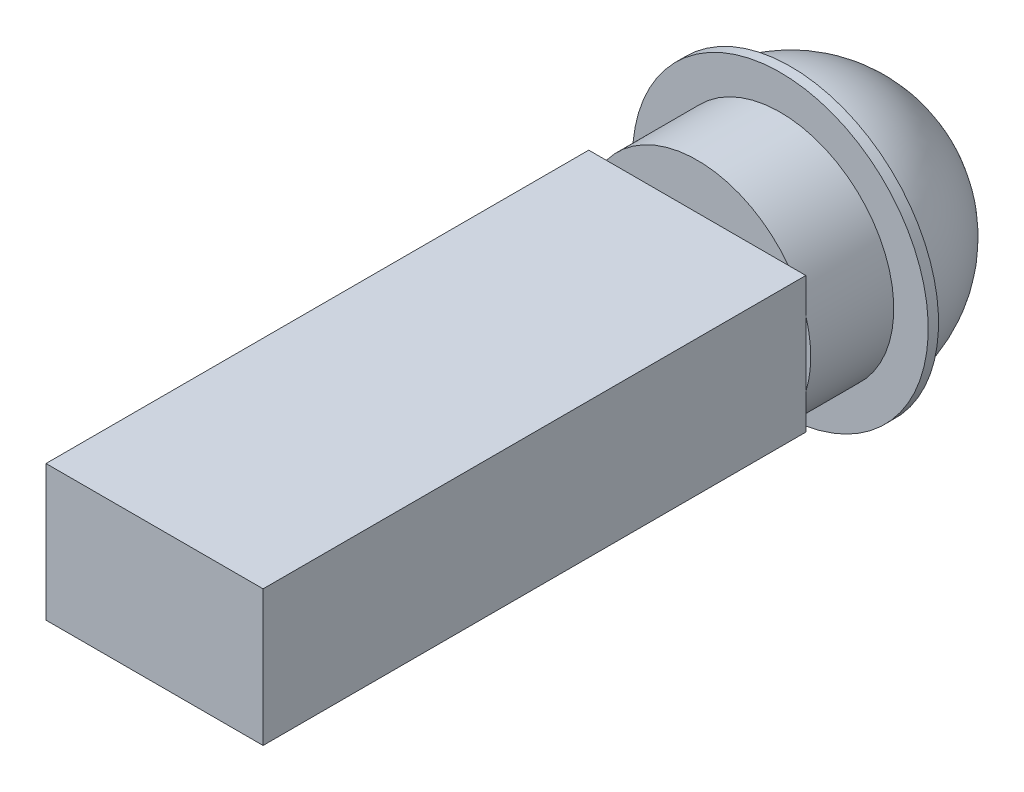
ISO-10303-21;
HEADER;
FILE_DESCRIPTION(('STEP AP214'),'2;1');
FILE_NAME('part.step','',(''),(''),'','','');
FILE_SCHEMA(('AUTOMOTIVE_DESIGN { 1 0 10303 214 1 1 1 1 }'));
ENDSEC;
DATA;
#1=APPLICATION_CONTEXT('core data for automotive mechanical design processes');
#2=APPLICATION_PROTOCOL_DEFINITION('international standard','automotive_design',2000,#1);
#3=PRODUCT_CONTEXT('',#1,'mechanical');
#4=PRODUCT('Part','Part','',(#3));
#5=PRODUCT_RELATED_PRODUCT_CATEGORY('part','',(#4));
#6=PRODUCT_DEFINITION_FORMATION('','',#4);
#7=PRODUCT_DEFINITION_CONTEXT('part definition',#1,'design');
#8=PRODUCT_DEFINITION('design','',#6,#7);
#9=PRODUCT_DEFINITION_SHAPE('','',#8);
#10=(LENGTH_UNIT() NAMED_UNIT(*) SI_UNIT(.MILLI.,.METRE.));
#11=(NAMED_UNIT(*) PLANE_ANGLE_UNIT() SI_UNIT($,.RADIAN.));
#12=(NAMED_UNIT(*) SI_UNIT($,.STERADIAN.) SOLID_ANGLE_UNIT());
#13=UNCERTAINTY_MEASURE_WITH_UNIT(LENGTH_MEASURE(1.E-05),#10,'distance_accuracy_value','');
#14=(GEOMETRIC_REPRESENTATION_CONTEXT(3) GLOBAL_UNCERTAINTY_ASSIGNED_CONTEXT((#13)) GLOBAL_UNIT_ASSIGNED_CONTEXT((#10,
#11,#12)) REPRESENTATION_CONTEXT('',''));
#15=CARTESIAN_POINT('',(0.,0.,0.));
#16=DIRECTION('',(0.,0.,1.));
#17=DIRECTION('',(1.,0.,0.));
#18=AXIS2_PLACEMENT_3D('',#15,#16,#17);
#19=CARTESIAN_POINT('',(0.,0.,4.3688));
#20=DIRECTION('',(0.,0.,1.));
#21=DIRECTION('',(1.,0.,0.));
#22=AXIS2_PLACEMENT_3D('',#19,#20,#21);
#23=PLANE('',#22);
#24=DIRECTION('',(0.,-1.,0.));
#25=VECTOR('',#24,1.);
#26=CARTESIAN_POINT('',(-5.08,3.175,4.3688));
#27=LINE('',#26,#25);
#28=CARTESIAN_POINT('',(-5.08,1.54104962931113,4.3688));
#29=VERTEX_POINT('',#28);
#30=CARTESIAN_POINT('',(-5.08,-1.54104962931113,4.3688));
#31=VERTEX_POINT('',#30);
#32=EDGE_CURVE('E11',#29,#31,#27,.T.);
#33=ORIENTED_EDGE('',*,*,#32,.F.);
#34=CARTESIAN_POINT('',(0.,0.,4.3688));
#35=DIRECTION('',(0.,0.,-1.));
#36=DIRECTION('',(-1.,0.,0.));
#37=AXIS2_PLACEMENT_3D('',#34,#35,#36);
#38=CIRCLE('',#37,5.3086);
#39=EDGE_CURVE('E51',#31,#29,#38,.T.);
#40=ORIENTED_EDGE('',*,*,#39,.F.);
#41=EDGE_LOOP('',(#33,#40));
#42=FACE_BOUND('',#41,.T.);
#43=ADVANCED_FACE('F33',(#42),#23,.T.);
#44=DIRECTION('',(-1.,0.,0.));
#45=VECTOR('',#44,1.);
#46=CARTESIAN_POINT('',(5.08,3.175,4.3688));
#47=LINE('',#46,#45);
#48=CARTESIAN_POINT('',(4.25448104473389,3.175,4.3688));
#49=VERTEX_POINT('',#48);
#50=CARTESIAN_POINT('',(-4.25448104473389,3.175,4.3688));
#51=VERTEX_POINT('',#50);
#52=EDGE_CURVE('E42',#49,#51,#47,.T.);
#53=ORIENTED_EDGE('',*,*,#52,.F.);
#54=EDGE_CURVE('E151',#51,#49,#38,.T.);
#55=ORIENTED_EDGE('',*,*,#54,.F.);
#56=EDGE_LOOP('',(#53,#55));
#57=FACE_BOUND('',#56,.T.);
#58=ADVANCED_FACE('F213',(#57),#23,.T.);
#59=DIRECTION('',(0.,1.,0.));
#60=VECTOR('',#59,1.);
#61=CARTESIAN_POINT('',(5.08,3.175,4.3688));
#62=LINE('',#61,#60);
#63=CARTESIAN_POINT('',(5.08,-1.54104962931114,4.3688));
#64=VERTEX_POINT('',#63);
#65=CARTESIAN_POINT('',(5.08,1.54104962931114,4.3688));
#66=VERTEX_POINT('',#65);
#67=EDGE_CURVE('E154',#64,#66,#62,.T.);
#68=ORIENTED_EDGE('',*,*,#67,.F.);
#69=EDGE_CURVE('E161',#66,#64,#38,.T.);
#70=ORIENTED_EDGE('',*,*,#69,.F.);
#71=EDGE_LOOP('',(#68,#70));
#72=FACE_BOUND('',#71,.T.);
#73=ADVANCED_FACE('F218',(#72),#23,.T.);
#74=CARTESIAN_POINT('',(0.,0.,0.));
#75=DIRECTION('',(0.,0.,-1.));
#76=DIRECTION('',(1.,0.,0.));
#77=AXIS2_PLACEMENT_3D('',#74,#75,#76);
#78=SPHERICAL_SURFACE('',#77,6.20395);
#79=CARTESIAN_POINT('',(0.,0.,0.));
#80=DIRECTION('',(0.,0.,-1.));
#81=DIRECTION('',(-1.,0.,0.));
#82=AXIS2_PLACEMENT_3D('',#79,#80,#81);
#83=CIRCLE('',#82,6.20395);
#84=CARTESIAN_POINT('',(-6.20395,0.,0.));
#85=VERTEX_POINT('',#84);
#86=EDGE_CURVE('E129',#85,#85,#83,.T.);
#87=ORIENTED_EDGE('',*,*,#86,.T.);
#88=EDGE_LOOP('',(#87));
#89=FACE_BOUND('',#88,.T.);
#90=ADVANCED_FACE('F35',(#89),#78,.T.);
#91=DIRECTION('',(1.,0.,0.));
#92=VECTOR('',#91,1.);
#93=CARTESIAN_POINT('',(5.08,-3.175,4.3688));
#94=LINE('',#93,#92);
#95=CARTESIAN_POINT('',(-4.25448104473389,-3.175,4.3688));
#96=VERTEX_POINT('',#95);
#97=CARTESIAN_POINT('',(4.25448104473389,-3.175,4.3688));
#98=VERTEX_POINT('',#97);
#99=EDGE_CURVE('E58',#96,#98,#94,.T.);
#100=ORIENTED_EDGE('',*,*,#99,.F.);
#101=EDGE_CURVE('E150',#98,#96,#38,.T.);
#102=ORIENTED_EDGE('',*,*,#101,.F.);
#103=EDGE_LOOP('',(#100,#102));
#104=FACE_BOUND('',#103,.T.);
#105=ADVANCED_FACE('F214',(#104),#23,.T.);
#106=CARTESIAN_POINT('',(0.,0.,-6.20395));
#107=DIRECTION('',(0.,0.,-1.));
#108=DIRECTION('',(-1.,0.,0.));
#109=AXIS2_PLACEMENT_3D('',#106,#107,#108);
#110=CYLINDRICAL_SURFACE('',#109,5.3086);
#111=EDGE_CURVE('E37',#29,#51,#38,.T.);
#112=ORIENTED_EDGE('',*,*,#111,.T.);
#113=ORIENTED_EDGE('',*,*,#54,.T.);
#114=EDGE_CURVE('E158',#49,#66,#38,.T.);
#115=ORIENTED_EDGE('',*,*,#114,.T.);
#116=ORIENTED_EDGE('',*,*,#69,.T.);
#117=EDGE_CURVE('E164',#64,#98,#38,.T.);
#118=ORIENTED_EDGE('',*,*,#117,.T.);
#119=ORIENTED_EDGE('',*,*,#101,.T.);
#120=EDGE_CURVE('E146',#96,#31,#38,.T.);
#121=ORIENTED_EDGE('',*,*,#120,.T.);
#122=ORIENTED_EDGE('',*,*,#39,.T.);
#123=EDGE_LOOP('',(#112,#113,#115,#116,#118,#119,#121,#122));
#124=FACE_BOUND('',#123,.T.);
#125=CARTESIAN_POINT('',(0.,0.,0.482599999999999));
#126=DIRECTION('',(0.,0.,-1.));
#127=DIRECTION('',(-1.,0.,0.));
#128=AXIS2_PLACEMENT_3D('',#125,#126,#127);
#129=CIRCLE('',#128,5.3086);
#130=CARTESIAN_POINT('',(-5.3086,0.,0.482599999999999));
#131=VERTEX_POINT('',#130);
#132=EDGE_CURVE('E142',#131,#131,#129,.T.);
#133=ORIENTED_EDGE('',*,*,#132,.F.);
#134=EDGE_LOOP('',(#133));
#135=FACE_BOUND('',#134,.T.);
#136=ADVANCED_FACE('F167',(#124,#135),#110,.T.);
#137=CARTESIAN_POINT('',(-5.3086,0.,0.4826));
#138=DIRECTION('',(0.,0.,1.));
#139=DIRECTION('',(1.,0.,0.));
#140=AXIS2_PLACEMENT_3D('',#137,#138,#139);
#141=PLANE('',#140);
#142=ORIENTED_EDGE('',*,*,#132,.T.);
#143=EDGE_LOOP('',(#142));
#144=FACE_BOUND('',#143,.T.);
#145=CARTESIAN_POINT('',(0.,0.,0.4826));
#146=DIRECTION('',(0.,0.,-1.));
#147=DIRECTION('',(-1.,0.,0.));
#148=AXIS2_PLACEMENT_3D('',#145,#146,#147);
#149=CIRCLE('',#148,6.9215);
#150=CARTESIAN_POINT('',(-6.9215,0.,0.4826));
#151=VERTEX_POINT('',#150);
#152=EDGE_CURVE('E140',#151,#151,#149,.T.);
#153=ORIENTED_EDGE('',*,*,#152,.F.);
#154=EDGE_LOOP('',(#153));
#155=FACE_BOUND('',#154,.T.);
#156=ADVANCED_FACE('F226',(#144,#155),#141,.T.);
#157=CARTESIAN_POINT('',(0.,0.,-6.20395));
#158=DIRECTION('',(0.,0.,-1.));
#159=DIRECTION('',(-1.,0.,0.));
#160=AXIS2_PLACEMENT_3D('',#157,#158,#159);
#161=CYLINDRICAL_SURFACE('',#160,6.9215);
#162=ORIENTED_EDGE('',*,*,#152,.T.);
#163=EDGE_LOOP('',(#162));
#164=FACE_BOUND('',#163,.T.);
#165=CARTESIAN_POINT('',(0.,0.,0.));
#166=DIRECTION('',(0.,0.,-1.));
#167=DIRECTION('',(-1.,0.,0.));
#168=AXIS2_PLACEMENT_3D('',#165,#166,#167);
#169=CIRCLE('',#168,6.9215);
#170=CARTESIAN_POINT('',(-6.9215,0.,0.));
#171=VERTEX_POINT('',#170);
#172=EDGE_CURVE('E132',#171,#171,#169,.T.);
#173=ORIENTED_EDGE('',*,*,#172,.F.);
#174=EDGE_LOOP('',(#173));
#175=FACE_BOUND('',#174,.T.);
#176=ADVANCED_FACE('F206',(#164,#175),#161,.T.);
#177=CARTESIAN_POINT('',(-6.9215,0.,0.));
#178=DIRECTION('',(0.,0.,-1.));
#179=DIRECTION('',(-1.,0.,0.));
#180=AXIS2_PLACEMENT_3D('',#177,#178,#179);
#181=PLANE('',#180);
#182=ORIENTED_EDGE('',*,*,#172,.T.);
#183=EDGE_LOOP('',(#182));
#184=FACE_BOUND('',#183,.T.);
#185=ORIENTED_EDGE('',*,*,#86,.F.);
#186=EDGE_LOOP('',(#185));
#187=FACE_BOUND('',#186,.T.);
#188=ADVANCED_FACE('F199',(#184,#187),#181,.T.);
#189=CARTESIAN_POINT('',(0.,0.,4.3688));
#190=DIRECTION('',(0.,0.,-1.));
#191=DIRECTION('',(-1.,0.,0.));
#192=AXIS2_PLACEMENT_3D('',#189,#190,#191);
#193=PLANE('',#192);
#194=ORIENTED_EDGE('',*,*,#111,.F.);
#195=CARTESIAN_POINT('',(-5.08,3.175,4.3688));
#196=VERTEX_POINT('',#195);
#197=EDGE_CURVE('E44',#196,#29,#27,.T.);
#198=ORIENTED_EDGE('',*,*,#197,.F.);
#199=EDGE_CURVE('E178',#51,#196,#47,.T.);
#200=ORIENTED_EDGE('',*,*,#199,.F.);
#201=EDGE_LOOP('',(#194,#198,#200));
#202=FACE_BOUND('',#201,.T.);
#203=ADVANCED_FACE('F197',(#202),#193,.T.);
#204=ORIENTED_EDGE('',*,*,#114,.F.);
#205=CARTESIAN_POINT('',(5.08,3.175,4.3688));
#206=VERTEX_POINT('',#205);
#207=EDGE_CURVE('E123',#206,#49,#47,.T.);
#208=ORIENTED_EDGE('',*,*,#207,.F.);
#209=EDGE_CURVE('E172',#66,#206,#62,.T.);
#210=ORIENTED_EDGE('',*,*,#209,.F.);
#211=EDGE_LOOP('',(#204,#208,#210));
#212=FACE_BOUND('',#211,.T.);
#213=ADVANCED_FACE('F190',(#212),#193,.T.);
#214=ORIENTED_EDGE('',*,*,#117,.F.);
#215=CARTESIAN_POINT('',(5.08,-3.175,4.3688));
#216=VERTEX_POINT('',#215);
#217=EDGE_CURVE('E173',#216,#64,#62,.T.);
#218=ORIENTED_EDGE('',*,*,#217,.F.);
#219=EDGE_CURVE('E157',#98,#216,#94,.T.);
#220=ORIENTED_EDGE('',*,*,#219,.F.);
#221=EDGE_LOOP('',(#214,#218,#220));
#222=FACE_BOUND('',#221,.T.);
#223=ADVANCED_FACE('F205',(#222),#193,.T.);
#224=ORIENTED_EDGE('',*,*,#120,.F.);
#225=CARTESIAN_POINT('',(-5.08,-3.175,4.3688));
#226=VERTEX_POINT('',#225);
#227=EDGE_CURVE('E156',#226,#96,#94,.T.);
#228=ORIENTED_EDGE('',*,*,#227,.F.);
#229=EDGE_CURVE('E45',#31,#226,#27,.T.);
#230=ORIENTED_EDGE('',*,*,#229,.F.);
#231=EDGE_LOOP('',(#224,#228,#230));
#232=FACE_BOUND('',#231,.T.);
#233=ADVANCED_FACE('F171',(#232),#193,.T.);
#234=CARTESIAN_POINT('',(-5.08,3.175,29.7688));
#235=DIRECTION('',(1.,0.,0.));
#236=DIRECTION('',(0.,1.,0.));
#237=AXIS2_PLACEMENT_3D('',#234,#235,#236);
#238=PLANE('',#237);
#239=ORIENTED_EDGE('',*,*,#197,.T.);
#240=ORIENTED_EDGE('',*,*,#32,.T.);
#241=ORIENTED_EDGE('',*,*,#229,.T.);
#242=DIRECTION('',(0.,0.,-1.));
#243=VECTOR('',#242,1.);
#244=CARTESIAN_POINT('',(-5.08,-3.175,29.7688));
#245=LINE('',#244,#243);
#246=CARTESIAN_POINT('',(-5.08,-3.175,29.7688));
#247=VERTEX_POINT('',#246);
#248=EDGE_CURVE('E108',#247,#226,#245,.T.);
#249=ORIENTED_EDGE('',*,*,#248,.F.);
#250=DIRECTION('',(0.,-1.,0.));
#251=VECTOR('',#250,1.);
#252=CARTESIAN_POINT('',(-5.08,3.175,29.7688));
#253=LINE('',#252,#251);
#254=CARTESIAN_POINT('',(-5.08,3.175,29.7688));
#255=VERTEX_POINT('',#254);
#256=EDGE_CURVE('E114',#255,#247,#253,.T.);
#257=ORIENTED_EDGE('',*,*,#256,.F.);
#258=DIRECTION('',(0.,0.,-1.));
#259=VECTOR('',#258,1.);
#260=CARTESIAN_POINT('',(-5.08,3.175,29.7688));
#261=LINE('',#260,#259);
#262=EDGE_CURVE('E181',#255,#196,#261,.T.);
#263=ORIENTED_EDGE('',*,*,#262,.T.);
#264=EDGE_LOOP('',(#239,#240,#241,#249,#257,#263));
#265=FACE_BOUND('',#264,.T.);
#266=ADVANCED_FACE('F126',(#265),#238,.F.);
#267=CARTESIAN_POINT('',(5.08,-3.175,29.7688));
#268=DIRECTION('',(0.,1.,0.));
#269=DIRECTION('',(-1.,0.,0.));
#270=AXIS2_PLACEMENT_3D('',#267,#268,#269);
#271=PLANE('',#270);
#272=ORIENTED_EDGE('',*,*,#227,.T.);
#273=ORIENTED_EDGE('',*,*,#99,.T.);
#274=ORIENTED_EDGE('',*,*,#219,.T.);
#275=DIRECTION('',(0.,0.,-1.));
#276=VECTOR('',#275,1.);
#277=CARTESIAN_POINT('',(5.08,-3.175,29.7688));
#278=LINE('',#277,#276);
#279=CARTESIAN_POINT('',(5.08,-3.175,29.7688));
#280=VERTEX_POINT('',#279);
#281=EDGE_CURVE('E110',#280,#216,#278,.T.);
#282=ORIENTED_EDGE('',*,*,#281,.F.);
#283=DIRECTION('',(1.,0.,0.));
#284=VECTOR('',#283,1.);
#285=CARTESIAN_POINT('',(5.08,-3.175,29.7688));
#286=LINE('',#285,#284);
#287=EDGE_CURVE('E103',#247,#280,#286,.T.);
#288=ORIENTED_EDGE('',*,*,#287,.F.);
#289=ORIENTED_EDGE('',*,*,#248,.T.);
#290=EDGE_LOOP('',(#272,#273,#274,#282,#288,#289));
#291=FACE_BOUND('',#290,.T.);
#292=ADVANCED_FACE('F106',(#291),#271,.F.);
#293=CARTESIAN_POINT('',(5.08,3.175,29.7688));
#294=DIRECTION('',(-1.,0.,0.));
#295=DIRECTION('',(0.,0.,1.));
#296=AXIS2_PLACEMENT_3D('',#293,#294,#295);
#297=PLANE('',#296);
#298=ORIENTED_EDGE('',*,*,#217,.T.);
#299=ORIENTED_EDGE('',*,*,#67,.T.);
#300=ORIENTED_EDGE('',*,*,#209,.T.);
#301=DIRECTION('',(0.,0.,-1.));
#302=VECTOR('',#301,1.);
#303=CARTESIAN_POINT('',(5.08,3.175,29.7688));
#304=LINE('',#303,#302);
#305=CARTESIAN_POINT('',(5.08,3.175,29.7688));
#306=VERTEX_POINT('',#305);
#307=EDGE_CURVE('E134',#306,#206,#304,.T.);
#308=ORIENTED_EDGE('',*,*,#307,.F.);
#309=DIRECTION('',(0.,1.,0.));
#310=VECTOR('',#309,1.);
#311=CARTESIAN_POINT('',(5.08,3.175,29.7688));
#312=LINE('',#311,#310);
#313=EDGE_CURVE('E113',#280,#306,#312,.T.);
#314=ORIENTED_EDGE('',*,*,#313,.F.);
#315=ORIENTED_EDGE('',*,*,#281,.T.);
#316=EDGE_LOOP('',(#298,#299,#300,#308,#314,#315));
#317=FACE_BOUND('',#316,.T.);
#318=ADVANCED_FACE('F192',(#317),#297,.F.);
#319=CARTESIAN_POINT('',(5.08,3.175,29.7688));
#320=DIRECTION('',(0.,-1.,0.));
#321=DIRECTION('',(1.,0.,0.));
#322=AXIS2_PLACEMENT_3D('',#319,#320,#321);
#323=PLANE('',#322);
#324=ORIENTED_EDGE('',*,*,#207,.T.);
#325=ORIENTED_EDGE('',*,*,#52,.T.);
#326=ORIENTED_EDGE('',*,*,#199,.T.);
#327=ORIENTED_EDGE('',*,*,#262,.F.);
#328=DIRECTION('',(-1.,0.,0.));
#329=VECTOR('',#328,1.);
#330=CARTESIAN_POINT('',(5.08,3.175,29.7688));
#331=LINE('',#330,#329);
#332=EDGE_CURVE('E119',#306,#255,#331,.T.);
#333=ORIENTED_EDGE('',*,*,#332,.F.);
#334=ORIENTED_EDGE('',*,*,#307,.T.);
#335=EDGE_LOOP('',(#324,#325,#326,#327,#333,#334));
#336=FACE_BOUND('',#335,.T.);
#337=ADVANCED_FACE('F186',(#336),#323,.F.);
#338=CARTESIAN_POINT('',(0.,0.,29.7688));
#339=DIRECTION('',(0.,0.,-1.));
#340=DIRECTION('',(-1.,0.,0.));
#341=AXIS2_PLACEMENT_3D('',#338,#339,#340);
#342=PLANE('',#341);
#343=ORIENTED_EDGE('',*,*,#256,.T.);
#344=ORIENTED_EDGE('',*,*,#287,.T.);
#345=ORIENTED_EDGE('',*,*,#313,.T.);
#346=ORIENTED_EDGE('',*,*,#332,.T.);
#347=EDGE_LOOP('',(#343,#344,#345,#346));
#348=FACE_BOUND('',#347,.T.);
#349=ADVANCED_FACE('F117',(#348),#342,.F.);
#350=CLOSED_SHELL('',(#43,#58,#73,#90,#105,#136,#156,#176,#188,#203,#213,#223,#233,#266,#292,
#318,#337,#349));
#351=MANIFOLD_SOLID_BREP('B2',#350);
#352=ADVANCED_BREP_SHAPE_REPRESENTATION('',(#18,#351),#14);
#353=SHAPE_DEFINITION_REPRESENTATION(#9,#352);
ENDSEC;
END-ISO-10303-21;
